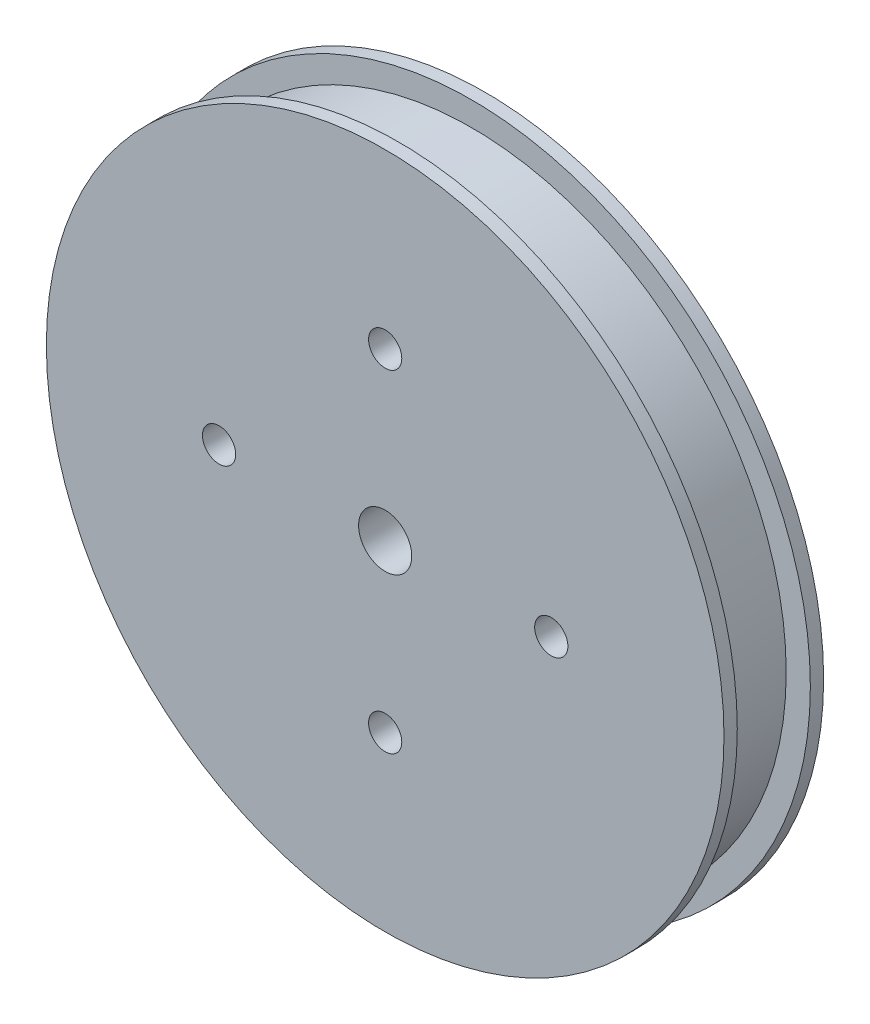
ISO-10303-21;
HEADER;
FILE_DESCRIPTION(('STEP AP214'),'2;1');
FILE_NAME('part.step','',(''),(''),'','','');
FILE_SCHEMA(('AUTOMOTIVE_DESIGN { 1 0 10303 214 1 1 1 1 }'));
ENDSEC;
DATA;
#1=APPLICATION_CONTEXT('core data for automotive mechanical design processes');
#2=APPLICATION_PROTOCOL_DEFINITION('international standard','automotive_design',2000,#1);
#3=PRODUCT_CONTEXT('',#1,'mechanical');
#4=PRODUCT('Part','Part','',(#3));
#5=PRODUCT_RELATED_PRODUCT_CATEGORY('part','',(#4));
#6=PRODUCT_DEFINITION_FORMATION('','',#4);
#7=PRODUCT_DEFINITION_CONTEXT('part definition',#1,'design');
#8=PRODUCT_DEFINITION('design','',#6,#7);
#9=PRODUCT_DEFINITION_SHAPE('','',#8);
#10=(LENGTH_UNIT() NAMED_UNIT(*) SI_UNIT(.MILLI.,.METRE.));
#11=(NAMED_UNIT(*) PLANE_ANGLE_UNIT() SI_UNIT($,.RADIAN.));
#12=(NAMED_UNIT(*) SI_UNIT($,.STERADIAN.) SOLID_ANGLE_UNIT());
#13=UNCERTAINTY_MEASURE_WITH_UNIT(LENGTH_MEASURE(1.E-05),#10,'distance_accuracy_value','');
#14=(GEOMETRIC_REPRESENTATION_CONTEXT(3) GLOBAL_UNCERTAINTY_ASSIGNED_CONTEXT((#13)) GLOBAL_UNIT_ASSIGNED_CONTEXT((#10,
#11,#12)) REPRESENTATION_CONTEXT('',''));
#15=CARTESIAN_POINT('',(0.,0.,0.));
#16=DIRECTION('',(0.,0.,1.));
#17=DIRECTION('',(1.,0.,0.));
#18=AXIS2_PLACEMENT_3D('',#15,#16,#17);
#19=CARTESIAN_POINT('',(0.,0.,15.));
#20=DIRECTION('',(0.,0.,-1.));
#21=DIRECTION('',(-1.,0.,0.));
#22=AXIS2_PLACEMENT_3D('',#19,#20,#21);
#23=CYLINDRICAL_SURFACE('',#22,51.);
#24=CARTESIAN_POINT('',(0.,0.,0.));
#25=DIRECTION('',(0.,0.,1.));
#26=DIRECTION('',(1.,0.,0.));
#27=AXIS2_PLACEMENT_3D('',#24,#25,#26);
#28=CIRCLE('',#27,51.);
#29=CARTESIAN_POINT('',(51.,0.,0.));
#30=VERTEX_POINT('',#29);
#31=EDGE_CURVE('E36',#30,#30,#28,.T.);
#32=ORIENTED_EDGE('',*,*,#31,.T.);
#33=EDGE_LOOP('',(#32));
#34=FACE_BOUND('',#33,.T.);
#35=CARTESIAN_POINT('',(0.,0.,2.));
#36=DIRECTION('',(0.,0.,1.));
#37=DIRECTION('',(1.,0.,0.));
#38=AXIS2_PLACEMENT_3D('',#35,#36,#37);
#39=CIRCLE('',#38,51.);
#40=CARTESIAN_POINT('',(51.,0.,2.));
#41=VERTEX_POINT('',#40);
#42=EDGE_CURVE('E74',#41,#41,#39,.T.);
#43=ORIENTED_EDGE('',*,*,#42,.F.);
#44=EDGE_LOOP('',(#43));
#45=FACE_BOUND('',#44,.T.);
#46=ADVANCED_FACE('F32',(#34,#45),#23,.T.);
#47=CARTESIAN_POINT('',(0.,0.,15.));
#48=DIRECTION('',(0.,0.,1.));
#49=DIRECTION('',(1.,0.,0.));
#50=AXIS2_PLACEMENT_3D('',#47,#48,#49);
#51=PLANE('',#50);
#52=CARTESIAN_POINT('',(0.,25.,15.));
#53=DIRECTION('',(0.,0.,1.));
#54=DIRECTION('',(1.,0.,0.));
#55=AXIS2_PLACEMENT_3D('',#52,#53,#54);
#56=CIRCLE('',#55,2.5);
#57=CARTESIAN_POINT('',(2.5,25.,15.));
#58=VERTEX_POINT('',#57);
#59=EDGE_CURVE('E71',#58,#58,#56,.T.);
#60=ORIENTED_EDGE('',*,*,#59,.F.);
#61=EDGE_LOOP('',(#60));
#62=FACE_BOUND('',#61,.T.);
#63=CARTESIAN_POINT('',(-25.,0.,15.));
#64=DIRECTION('',(0.,0.,1.));
#65=DIRECTION('',(1.,0.,0.));
#66=AXIS2_PLACEMENT_3D('',#63,#64,#65);
#67=CIRCLE('',#66,2.5);
#68=CARTESIAN_POINT('',(-22.5,0.,15.));
#69=VERTEX_POINT('',#68);
#70=EDGE_CURVE('E65',#69,#69,#67,.T.);
#71=ORIENTED_EDGE('',*,*,#70,.F.);
#72=EDGE_LOOP('',(#71));
#73=FACE_BOUND('',#72,.T.);
#74=CARTESIAN_POINT('',(0.,-25.,15.));
#75=DIRECTION('',(0.,0.,1.));
#76=DIRECTION('',(1.,0.,0.));
#77=AXIS2_PLACEMENT_3D('',#74,#75,#76);
#78=CIRCLE('',#77,2.5);
#79=CARTESIAN_POINT('',(2.5,-25.,15.));
#80=VERTEX_POINT('',#79);
#81=EDGE_CURVE('E59',#80,#80,#78,.T.);
#82=ORIENTED_EDGE('',*,*,#81,.F.);
#83=EDGE_LOOP('',(#82));
#84=FACE_BOUND('',#83,.T.);
#85=CARTESIAN_POINT('',(25.,0.,15.));
#86=DIRECTION('',(0.,0.,1.));
#87=DIRECTION('',(1.,0.,0.));
#88=AXIS2_PLACEMENT_3D('',#85,#86,#87);
#89=CIRCLE('',#88,2.5);
#90=CARTESIAN_POINT('',(27.5,0.,15.));
#91=VERTEX_POINT('',#90);
#92=EDGE_CURVE('E53',#91,#91,#89,.T.);
#93=ORIENTED_EDGE('',*,*,#92,.F.);
#94=EDGE_LOOP('',(#93));
#95=FACE_BOUND('',#94,.T.);
#96=CARTESIAN_POINT('',(0.,0.,15.));
#97=DIRECTION('',(0.,0.,1.));
#98=DIRECTION('',(1.,0.,0.));
#99=AXIS2_PLACEMENT_3D('',#96,#97,#98);
#100=CIRCLE('',#99,51.);
#101=CARTESIAN_POINT('',(51.,0.,15.));
#102=VERTEX_POINT('',#101);
#103=EDGE_CURVE('E10',#102,#102,#100,.T.);
#104=ORIENTED_EDGE('',*,*,#103,.T.);
#105=EDGE_LOOP('',(#104));
#106=FACE_BOUND('',#105,.T.);
#107=CARTESIAN_POINT('',(0.,0.,15.));
#108=DIRECTION('',(0.,0.,1.));
#109=DIRECTION('',(1.,0.,0.));
#110=AXIS2_PLACEMENT_3D('',#107,#108,#109);
#111=CIRCLE('',#110,4.);
#112=CARTESIAN_POINT('',(4.,0.,15.));
#113=VERTEX_POINT('',#112);
#114=EDGE_CURVE('E43',#113,#113,#111,.T.);
#115=ORIENTED_EDGE('',*,*,#114,.F.);
#116=EDGE_LOOP('',(#115));
#117=FACE_BOUND('',#116,.T.);
#118=ADVANCED_FACE('F99',(#62,#73,#84,#95,#106,#117),#51,.T.);
#119=CARTESIAN_POINT('',(0.,0.,0.));
#120=DIRECTION('',(0.,0.,1.));
#121=DIRECTION('',(1.,0.,0.));
#122=AXIS2_PLACEMENT_3D('',#119,#120,#121);
#123=PLANE('',#122);
#124=CARTESIAN_POINT('',(0.,25.,0.));
#125=DIRECTION('',(0.,0.,1.));
#126=DIRECTION('',(1.,0.,0.));
#127=AXIS2_PLACEMENT_3D('',#124,#125,#126);
#128=CIRCLE('',#127,2.5);
#129=CARTESIAN_POINT('',(2.5,25.,0.));
#130=VERTEX_POINT('',#129);
#131=EDGE_CURVE('E68',#130,#130,#128,.T.);
#132=ORIENTED_EDGE('',*,*,#131,.T.);
#133=EDGE_LOOP('',(#132));
#134=FACE_BOUND('',#133,.T.);
#135=CARTESIAN_POINT('',(-25.,0.,0.));
#136=DIRECTION('',(0.,0.,1.));
#137=DIRECTION('',(1.,0.,0.));
#138=AXIS2_PLACEMENT_3D('',#135,#136,#137);
#139=CIRCLE('',#138,2.5);
#140=CARTESIAN_POINT('',(-22.5,0.,0.));
#141=VERTEX_POINT('',#140);
#142=EDGE_CURVE('E62',#141,#141,#139,.T.);
#143=ORIENTED_EDGE('',*,*,#142,.T.);
#144=EDGE_LOOP('',(#143));
#145=FACE_BOUND('',#144,.T.);
#146=CARTESIAN_POINT('',(0.,-25.,0.));
#147=DIRECTION('',(0.,0.,1.));
#148=DIRECTION('',(1.,0.,0.));
#149=AXIS2_PLACEMENT_3D('',#146,#147,#148);
#150=CIRCLE('',#149,2.5);
#151=CARTESIAN_POINT('',(2.5,-25.,0.));
#152=VERTEX_POINT('',#151);
#153=EDGE_CURVE('E56',#152,#152,#150,.T.);
#154=ORIENTED_EDGE('',*,*,#153,.T.);
#155=EDGE_LOOP('',(#154));
#156=FACE_BOUND('',#155,.T.);
#157=CARTESIAN_POINT('',(25.,0.,0.));
#158=DIRECTION('',(0.,0.,1.));
#159=DIRECTION('',(1.,0.,0.));
#160=AXIS2_PLACEMENT_3D('',#157,#158,#159);
#161=CIRCLE('',#160,2.5);
#162=CARTESIAN_POINT('',(27.5,0.,0.));
#163=VERTEX_POINT('',#162);
#164=EDGE_CURVE('E48',#163,#163,#161,.T.);
#165=ORIENTED_EDGE('',*,*,#164,.T.);
#166=EDGE_LOOP('',(#165));
#167=FACE_BOUND('',#166,.T.);
#168=ORIENTED_EDGE('',*,*,#31,.F.);
#169=EDGE_LOOP('',(#168));
#170=FACE_BOUND('',#169,.T.);
#171=CARTESIAN_POINT('',(0.,0.,0.));
#172=DIRECTION('',(0.,0.,1.));
#173=DIRECTION('',(1.,0.,0.));
#174=AXIS2_PLACEMENT_3D('',#171,#172,#173);
#175=CIRCLE('',#174,4.);
#176=CARTESIAN_POINT('',(4.,0.,0.));
#177=VERTEX_POINT('',#176);
#178=EDGE_CURVE('E45',#177,#177,#175,.T.);
#179=ORIENTED_EDGE('',*,*,#178,.T.);
#180=EDGE_LOOP('',(#179));
#181=FACE_BOUND('',#180,.T.);
#182=ADVANCED_FACE('F104',(#134,#145,#156,#167,#170,#181),#123,.F.);
#183=CARTESIAN_POINT('',(0.,0.,13.));
#184=DIRECTION('',(0.,0.,1.));
#185=DIRECTION('',(1.,0.,0.));
#186=AXIS2_PLACEMENT_3D('',#183,#184,#185);
#187=CIRCLE('',#186,51.);
#188=CARTESIAN_POINT('',(51.,0.,13.));
#189=VERTEX_POINT('',#188);
#190=EDGE_CURVE('E75',#189,#189,#187,.T.);
#191=ORIENTED_EDGE('',*,*,#190,.T.);
#192=EDGE_LOOP('',(#191));
#193=FACE_BOUND('',#192,.T.);
#194=ORIENTED_EDGE('',*,*,#103,.F.);
#195=EDGE_LOOP('',(#194));
#196=FACE_BOUND('',#195,.T.);
#197=ADVANCED_FACE('F34',(#193,#196),#23,.T.);
#198=CARTESIAN_POINT('',(0.,0.,15.));
#199=DIRECTION('',(0.,0.,-1.));
#200=DIRECTION('',(-1.,0.,0.));
#201=AXIS2_PLACEMENT_3D('',#198,#199,#200);
#202=CYLINDRICAL_SURFACE('',#201,4.);
#203=ORIENTED_EDGE('',*,*,#114,.T.);
#204=EDGE_LOOP('',(#203));
#205=FACE_BOUND('',#204,.T.);
#206=ORIENTED_EDGE('',*,*,#178,.F.);
#207=EDGE_LOOP('',(#206));
#208=FACE_BOUND('',#207,.T.);
#209=ADVANCED_FACE('F108',(#205,#208),#202,.F.);
#210=CARTESIAN_POINT('',(25.,0.,15.));
#211=DIRECTION('',(0.,0.,1.));
#212=DIRECTION('',(1.,0.,0.));
#213=AXIS2_PLACEMENT_3D('',#210,#211,#212);
#214=CYLINDRICAL_SURFACE('',#213,2.5);
#215=ORIENTED_EDGE('',*,*,#164,.F.);
#216=EDGE_LOOP('',(#215));
#217=FACE_BOUND('',#216,.T.);
#218=ORIENTED_EDGE('',*,*,#92,.T.);
#219=EDGE_LOOP('',(#218));
#220=FACE_BOUND('',#219,.T.);
#221=ADVANCED_FACE('F114',(#217,#220),#214,.F.);
#222=CARTESIAN_POINT('',(0.,-25.,15.));
#223=DIRECTION('',(0.,0.,1.));
#224=DIRECTION('',(1.,0.,0.));
#225=AXIS2_PLACEMENT_3D('',#222,#223,#224);
#226=CYLINDRICAL_SURFACE('',#225,2.5);
#227=ORIENTED_EDGE('',*,*,#153,.F.);
#228=EDGE_LOOP('',(#227));
#229=FACE_BOUND('',#228,.T.);
#230=ORIENTED_EDGE('',*,*,#81,.T.);
#231=EDGE_LOOP('',(#230));
#232=FACE_BOUND('',#231,.T.);
#233=ADVANCED_FACE('F135',(#229,#232),#226,.F.);
#234=CARTESIAN_POINT('',(-25.,0.,15.));
#235=DIRECTION('',(0.,0.,1.));
#236=DIRECTION('',(1.,0.,0.));
#237=AXIS2_PLACEMENT_3D('',#234,#235,#236);
#238=CYLINDRICAL_SURFACE('',#237,2.5);
#239=ORIENTED_EDGE('',*,*,#142,.F.);
#240=EDGE_LOOP('',(#239));
#241=FACE_BOUND('',#240,.T.);
#242=ORIENTED_EDGE('',*,*,#70,.T.);
#243=EDGE_LOOP('',(#242));
#244=FACE_BOUND('',#243,.T.);
#245=ADVANCED_FACE('F131',(#241,#244),#238,.F.);
#246=CARTESIAN_POINT('',(0.,25.,15.));
#247=DIRECTION('',(0.,0.,1.));
#248=DIRECTION('',(1.,0.,0.));
#249=AXIS2_PLACEMENT_3D('',#246,#247,#248);
#250=CYLINDRICAL_SURFACE('',#249,2.5);
#251=ORIENTED_EDGE('',*,*,#131,.F.);
#252=EDGE_LOOP('',(#251));
#253=FACE_BOUND('',#252,.T.);
#254=ORIENTED_EDGE('',*,*,#59,.T.);
#255=EDGE_LOOP('',(#254));
#256=FACE_BOUND('',#255,.T.);
#257=ADVANCED_FACE('F94',(#253,#256),#250,.F.);
#258=CARTESIAN_POINT('',(0.,0.,2.));
#259=DIRECTION('',(0.,0.,1.));
#260=DIRECTION('',(1.,0.,0.));
#261=AXIS2_PLACEMENT_3D('',#258,#259,#260);
#262=PLANE('',#261);
#263=CARTESIAN_POINT('',(0.,0.,2.));
#264=DIRECTION('',(0.,0.,1.));
#265=DIRECTION('',(1.,0.,0.));
#266=AXIS2_PLACEMENT_3D('',#263,#264,#265);
#267=CIRCLE('',#266,47.365);
#268=CARTESIAN_POINT('',(47.365,0.,2.));
#269=VERTEX_POINT('',#268);
#270=EDGE_CURVE('E78',#269,#269,#267,.T.);
#271=ORIENTED_EDGE('',*,*,#270,.F.);
#272=EDGE_LOOP('',(#271));
#273=FACE_BOUND('',#272,.T.);
#274=ORIENTED_EDGE('',*,*,#42,.T.);
#275=EDGE_LOOP('',(#274));
#276=FACE_BOUND('',#275,.T.);
#277=ADVANCED_FACE('F90',(#273,#276),#262,.T.);
#278=CARTESIAN_POINT('',(0.,0.,13.));
#279=DIRECTION('',(0.,0.,1.));
#280=DIRECTION('',(1.,0.,0.));
#281=AXIS2_PLACEMENT_3D('',#278,#279,#280);
#282=PLANE('',#281);
#283=CARTESIAN_POINT('',(0.,0.,13.));
#284=DIRECTION('',(0.,0.,1.));
#285=DIRECTION('',(1.,0.,0.));
#286=AXIS2_PLACEMENT_3D('',#283,#284,#285);
#287=CIRCLE('',#286,47.365);
#288=CARTESIAN_POINT('',(47.365,0.,13.));
#289=VERTEX_POINT('',#288);
#290=EDGE_CURVE('E81',#289,#289,#287,.T.);
#291=ORIENTED_EDGE('',*,*,#290,.T.);
#292=EDGE_LOOP('',(#291));
#293=FACE_BOUND('',#292,.T.);
#294=ORIENTED_EDGE('',*,*,#190,.F.);
#295=EDGE_LOOP('',(#294));
#296=FACE_BOUND('',#295,.T.);
#297=ADVANCED_FACE('F93',(#293,#296),#282,.F.);
#298=CARTESIAN_POINT('',(0.,0.,2.));
#299=DIRECTION('',(0.,0.,1.));
#300=DIRECTION('',(1.,0.,0.));
#301=AXIS2_PLACEMENT_3D('',#298,#299,#300);
#302=CYLINDRICAL_SURFACE('',#301,47.365);
#303=ORIENTED_EDGE('',*,*,#270,.T.);
#304=EDGE_LOOP('',(#303));
#305=FACE_BOUND('',#304,.T.);
#306=ORIENTED_EDGE('',*,*,#290,.F.);
#307=EDGE_LOOP('',(#306));
#308=FACE_BOUND('',#307,.T.);
#309=ADVANCED_FACE('F87',(#305,#308),#302,.T.);
#310=CLOSED_SHELL('',(#46,#118,#182,#197,#209,#221,#233,#245,#257,#277,#297,#309));
#311=MANIFOLD_SOLID_BREP('B2',#310);
#312=ADVANCED_BREP_SHAPE_REPRESENTATION('',(#18,#311),#14);
#313=SHAPE_DEFINITION_REPRESENTATION(#9,#312);
ENDSEC;
END-ISO-10303-21;
